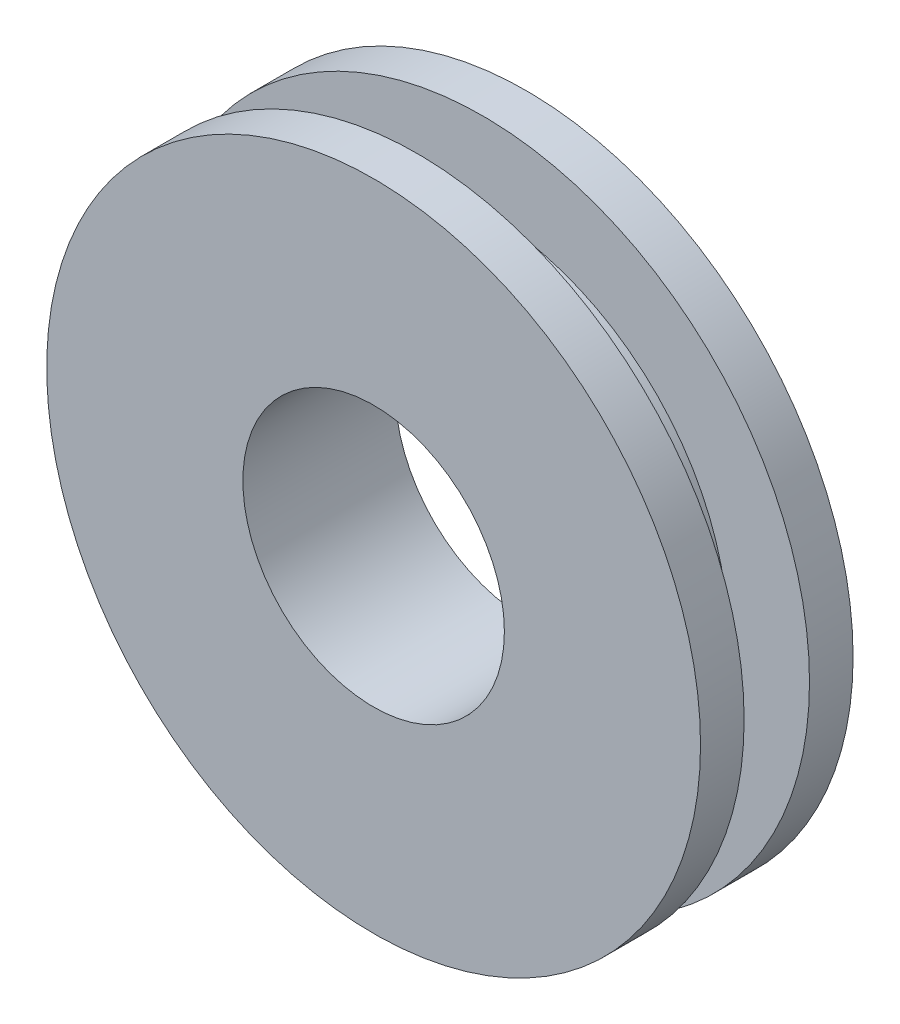
ISO-10303-21;
HEADER;
FILE_DESCRIPTION(('STEP AP214'),'2;1');
FILE_NAME('part.step','',(''),(''),'','','');
FILE_SCHEMA(('AUTOMOTIVE_DESIGN { 1 0 10303 214 1 1 1 1 }'));
ENDSEC;
DATA;
#1=APPLICATION_CONTEXT('core data for automotive mechanical design processes');
#2=APPLICATION_PROTOCOL_DEFINITION('international standard','automotive_design',2000,#1);
#3=PRODUCT_CONTEXT('',#1,'mechanical');
#4=PRODUCT('Part','Part','',(#3));
#5=PRODUCT_RELATED_PRODUCT_CATEGORY('part','',(#4));
#6=PRODUCT_DEFINITION_FORMATION('','',#4);
#7=PRODUCT_DEFINITION_CONTEXT('part definition',#1,'design');
#8=PRODUCT_DEFINITION('design','',#6,#7);
#9=PRODUCT_DEFINITION_SHAPE('','',#8);
#10=(LENGTH_UNIT() NAMED_UNIT(*) SI_UNIT(.MILLI.,.METRE.));
#11=(NAMED_UNIT(*) PLANE_ANGLE_UNIT() SI_UNIT($,.RADIAN.));
#12=(NAMED_UNIT(*) SI_UNIT($,.STERADIAN.) SOLID_ANGLE_UNIT());
#13=UNCERTAINTY_MEASURE_WITH_UNIT(LENGTH_MEASURE(1.E-05),#10,'distance_accuracy_value','');
#14=(GEOMETRIC_REPRESENTATION_CONTEXT(3) GLOBAL_UNCERTAINTY_ASSIGNED_CONTEXT((#13)) GLOBAL_UNIT_ASSIGNED_CONTEXT((#10,
#11,#12)) REPRESENTATION_CONTEXT('',''));
#15=CARTESIAN_POINT('',(0.,0.,0.));
#16=DIRECTION('',(0.,0.,1.));
#17=DIRECTION('',(1.,0.,0.));
#18=AXIS2_PLACEMENT_3D('',#15,#16,#17);
#19=CARTESIAN_POINT('',(8.485,8.485,0.4));
#20=DIRECTION('',(0.,0.,-1.));
#21=DIRECTION('',(-1.,0.,0.));
#22=AXIS2_PLACEMENT_3D('',#19,#20,#21);
#23=CYLINDRICAL_SURFACE('',#22,1.2);
#24=CARTESIAN_POINT('',(8.485,8.485,0.));
#25=DIRECTION('',(0.,0.,1.));
#26=DIRECTION('',(1.,0.,0.));
#27=AXIS2_PLACEMENT_3D('',#24,#25,#26);
#28=CIRCLE('',#27,1.2);
#29=CARTESIAN_POINT('',(9.685,8.485,0.));
#30=VERTEX_POINT('',#29);
#31=EDGE_CURVE('E75',#30,#30,#28,.T.);
#32=ORIENTED_EDGE('',*,*,#31,.F.);
#33=EDGE_LOOP('',(#32));
#34=FACE_BOUND('',#33,.T.);
#35=CARTESIAN_POINT('',(8.485,8.485,1.4));
#36=DIRECTION('',(0.,0.,1.));
#37=DIRECTION('',(1.,0.,0.));
#38=AXIS2_PLACEMENT_3D('',#35,#36,#37);
#39=CIRCLE('',#38,1.2);
#40=CARTESIAN_POINT('',(9.685,8.485,1.4));
#41=VERTEX_POINT('',#40);
#42=EDGE_CURVE('E95',#41,#41,#39,.T.);
#43=ORIENTED_EDGE('',*,*,#42,.T.);
#44=EDGE_LOOP('',(#43));
#45=FACE_BOUND('',#44,.T.);
#46=ADVANCED_FACE('F57',(#34,#45),#23,.F.);
#47=CARTESIAN_POINT('',(8.485,8.485,0.4));
#48=DIRECTION('',(0.,0.,-1.));
#49=DIRECTION('',(-1.,0.,0.));
#50=AXIS2_PLACEMENT_3D('',#47,#48,#49);
#51=CYLINDRICAL_SURFACE('',#50,3.);
#52=CARTESIAN_POINT('',(8.485,8.485,0.4));
#53=DIRECTION('',(0.,0.,1.));
#54=DIRECTION('',(1.,0.,0.));
#55=AXIS2_PLACEMENT_3D('',#52,#53,#54);
#56=CIRCLE('',#55,3.);
#57=CARTESIAN_POINT('',(11.485,8.485,0.4));
#58=VERTEX_POINT('',#57);
#59=EDGE_CURVE('E65',#58,#58,#56,.T.);
#60=ORIENTED_EDGE('',*,*,#59,.F.);
#61=EDGE_LOOP('',(#60));
#62=FACE_BOUND('',#61,.T.);
#63=CARTESIAN_POINT('',(8.485,8.485,0.));
#64=DIRECTION('',(0.,0.,1.));
#65=DIRECTION('',(1.,0.,0.));
#66=AXIS2_PLACEMENT_3D('',#63,#64,#65);
#67=CIRCLE('',#66,3.);
#68=CARTESIAN_POINT('',(11.485,8.485,0.));
#69=VERTEX_POINT('',#68);
#70=EDGE_CURVE('E60',#69,#69,#67,.T.);
#71=ORIENTED_EDGE('',*,*,#70,.T.);
#72=EDGE_LOOP('',(#71));
#73=FACE_BOUND('',#72,.T.);
#74=ADVANCED_FACE('F117',(#62,#73),#51,.T.);
#75=CARTESIAN_POINT('',(0.,0.,0.4));
#76=DIRECTION('',(0.,0.,1.));
#77=DIRECTION('',(1.,0.,0.));
#78=AXIS2_PLACEMENT_3D('',#75,#76,#77);
#79=PLANE('',#78);
#80=CARTESIAN_POINT('',(8.485,8.485,0.4));
#81=DIRECTION('',(0.,0.,1.));
#82=DIRECTION('',(1.,0.,0.));
#83=AXIS2_PLACEMENT_3D('',#80,#81,#82);
#84=CIRCLE('',#83,2.25);
#85=CARTESIAN_POINT('',(10.735,8.485,0.4));
#86=VERTEX_POINT('',#85);
#87=EDGE_CURVE('E11',#86,#86,#84,.T.);
#88=ORIENTED_EDGE('',*,*,#87,.F.);
#89=EDGE_LOOP('',(#88));
#90=FACE_BOUND('',#89,.T.);
#91=ORIENTED_EDGE('',*,*,#59,.T.);
#92=EDGE_LOOP('',(#91));
#93=FACE_BOUND('',#92,.T.);
#94=ADVANCED_FACE('F122',(#90,#93),#79,.T.);
#95=CARTESIAN_POINT('',(0.,0.,0.));
#96=DIRECTION('',(0.,0.,1.));
#97=DIRECTION('',(1.,0.,0.));
#98=AXIS2_PLACEMENT_3D('',#95,#96,#97);
#99=PLANE('',#98);
#100=ORIENTED_EDGE('',*,*,#31,.T.);
#101=EDGE_LOOP('',(#100));
#102=FACE_BOUND('',#101,.T.);
#103=ORIENTED_EDGE('',*,*,#70,.F.);
#104=EDGE_LOOP('',(#103));
#105=FACE_BOUND('',#104,.T.);
#106=ADVANCED_FACE('F114',(#102,#105),#99,.F.);
#107=CARTESIAN_POINT('',(8.485,8.485,1.));
#108=DIRECTION('',(0.,0.,-1.));
#109=DIRECTION('',(-1.,0.,0.));
#110=AXIS2_PLACEMENT_3D('',#107,#108,#109);
#111=CYLINDRICAL_SURFACE('',#110,2.25);
#112=CARTESIAN_POINT('',(8.485,8.485,1.));
#113=DIRECTION('',(0.,0.,1.));
#114=DIRECTION('',(1.,0.,0.));
#115=AXIS2_PLACEMENT_3D('',#112,#113,#114);
#116=CIRCLE('',#115,2.25);
#117=CARTESIAN_POINT('',(10.735,8.485,1.));
#118=VERTEX_POINT('',#117);
#119=EDGE_CURVE('E73',#118,#118,#116,.T.);
#120=ORIENTED_EDGE('',*,*,#119,.F.);
#121=EDGE_LOOP('',(#120));
#122=FACE_BOUND('',#121,.T.);
#123=ORIENTED_EDGE('',*,*,#87,.T.);
#124=EDGE_LOOP('',(#123));
#125=FACE_BOUND('',#124,.T.);
#126=ADVANCED_FACE('F105',(#122,#125),#111,.T.);
#127=CARTESIAN_POINT('',(8.485,8.485,1.4));
#128=DIRECTION('',(0.,0.,1.));
#129=DIRECTION('',(1.,0.,0.));
#130=AXIS2_PLACEMENT_3D('',#127,#128,#129);
#131=PLANE('',#130);
#132=CARTESIAN_POINT('',(8.485,8.485,1.4));
#133=DIRECTION('',(0.,0.,1.));
#134=DIRECTION('',(1.,0.,0.));
#135=AXIS2_PLACEMENT_3D('',#132,#133,#134);
#136=CIRCLE('',#135,3.);
#137=CARTESIAN_POINT('',(11.485,8.485,1.4));
#138=VERTEX_POINT('',#137);
#139=EDGE_CURVE('E84',#138,#138,#136,.T.);
#140=ORIENTED_EDGE('',*,*,#139,.T.);
#141=EDGE_LOOP('',(#140));
#142=FACE_BOUND('',#141,.T.);
#143=ORIENTED_EDGE('',*,*,#42,.F.);
#144=EDGE_LOOP('',(#143));
#145=FACE_BOUND('',#144,.T.);
#146=ADVANCED_FACE('F102',(#142,#145),#131,.T.);
#147=CARTESIAN_POINT('',(8.485,8.485,1.));
#148=DIRECTION('',(0.,0.,1.));
#149=DIRECTION('',(1.,0.,0.));
#150=AXIS2_PLACEMENT_3D('',#147,#148,#149);
#151=PLANE('',#150);
#152=ORIENTED_EDGE('',*,*,#119,.T.);
#153=EDGE_LOOP('',(#152));
#154=FACE_BOUND('',#153,.T.);
#155=CARTESIAN_POINT('',(8.485,8.485,1.));
#156=DIRECTION('',(0.,0.,1.));
#157=DIRECTION('',(1.,0.,0.));
#158=AXIS2_PLACEMENT_3D('',#155,#156,#157);
#159=CIRCLE('',#158,3.);
#160=CARTESIAN_POINT('',(11.485,8.485,1.));
#161=VERTEX_POINT('',#160);
#162=EDGE_CURVE('E89',#161,#161,#159,.T.);
#163=ORIENTED_EDGE('',*,*,#162,.F.);
#164=EDGE_LOOP('',(#163));
#165=FACE_BOUND('',#164,.T.);
#166=ADVANCED_FACE('F104',(#154,#165),#151,.F.);
#167=CARTESIAN_POINT('',(8.485,8.485,1.4));
#168=DIRECTION('',(0.,0.,-1.));
#169=DIRECTION('',(-1.,0.,0.));
#170=AXIS2_PLACEMENT_3D('',#167,#168,#169);
#171=CYLINDRICAL_SURFACE('',#170,3.);
#172=ORIENTED_EDGE('',*,*,#139,.F.);
#173=EDGE_LOOP('',(#172));
#174=FACE_BOUND('',#173,.T.);
#175=ORIENTED_EDGE('',*,*,#162,.T.);
#176=EDGE_LOOP('',(#175));
#177=FACE_BOUND('',#176,.T.);
#178=ADVANCED_FACE('F111',(#174,#177),#171,.T.);
#179=CLOSED_SHELL('',(#46,#74,#94,#106,#126,#146,#166,#178));
#180=MANIFOLD_SOLID_BREP('B2',#179);
#181=ADVANCED_BREP_SHAPE_REPRESENTATION('',(#18,#180),#14);
#182=SHAPE_DEFINITION_REPRESENTATION(#9,#181);
ENDSEC;
END-ISO-10303-21;
